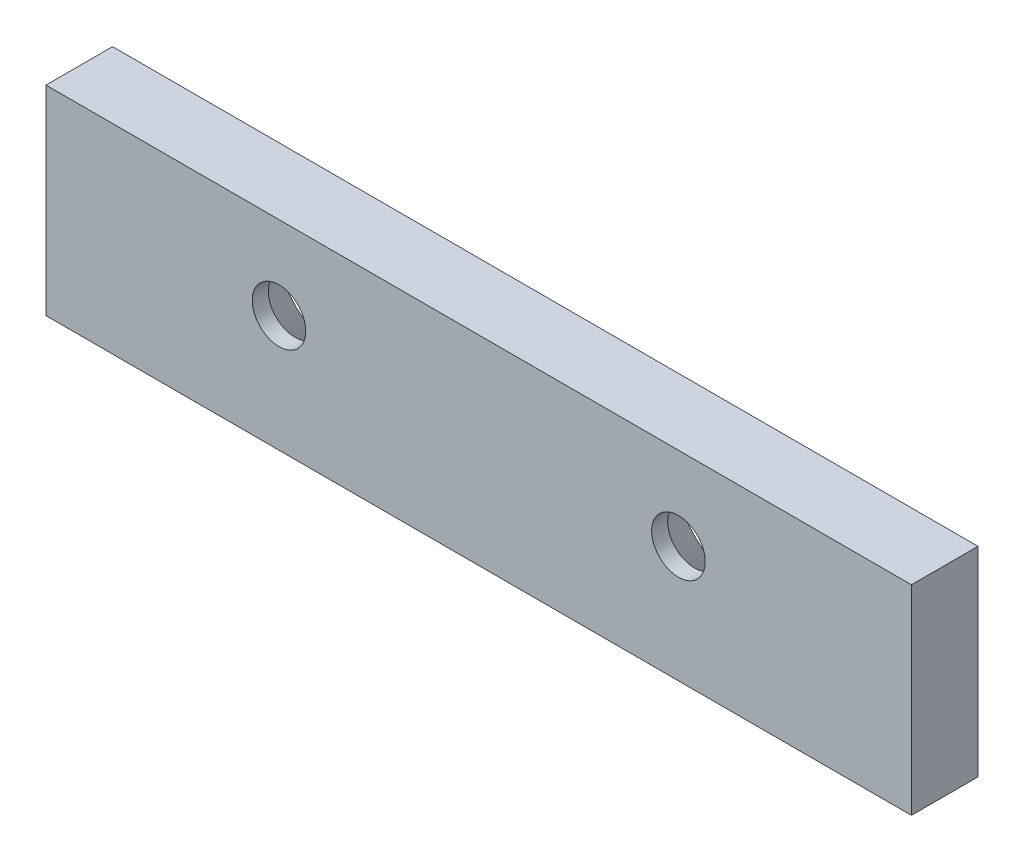
ISO-10303-21;
HEADER;
FILE_DESCRIPTION(('STEP AP214'),'2;1');
FILE_NAME('part.step','',(''),(''),'','','');
FILE_SCHEMA(('AUTOMOTIVE_DESIGN { 1 0 10303 214 1 1 1 1 }'));
ENDSEC;
DATA;
#1=APPLICATION_CONTEXT('core data for automotive mechanical design processes');
#2=APPLICATION_PROTOCOL_DEFINITION('international standard','automotive_design',2000,#1);
#3=PRODUCT_CONTEXT('',#1,'mechanical');
#4=PRODUCT('Part','Part','',(#3));
#5=PRODUCT_RELATED_PRODUCT_CATEGORY('part','',(#4));
#6=PRODUCT_DEFINITION_FORMATION('','',#4);
#7=PRODUCT_DEFINITION_CONTEXT('part definition',#1,'design');
#8=PRODUCT_DEFINITION('design','',#6,#7);
#9=PRODUCT_DEFINITION_SHAPE('','',#8);
#10=(LENGTH_UNIT() NAMED_UNIT(*) SI_UNIT(.MILLI.,.METRE.));
#11=(NAMED_UNIT(*) PLANE_ANGLE_UNIT() SI_UNIT($,.RADIAN.));
#12=(NAMED_UNIT(*) SI_UNIT($,.STERADIAN.) SOLID_ANGLE_UNIT());
#13=UNCERTAINTY_MEASURE_WITH_UNIT(LENGTH_MEASURE(1.E-05),#10,'distance_accuracy_value','');
#14=(GEOMETRIC_REPRESENTATION_CONTEXT(3) GLOBAL_UNCERTAINTY_ASSIGNED_CONTEXT((#13)) GLOBAL_UNIT_ASSIGNED_CONTEXT((#10,
#11,#12)) REPRESENTATION_CONTEXT('',''));
#15=CARTESIAN_POINT('',(0.,0.,0.));
#16=DIRECTION('',(0.,0.,1.));
#17=DIRECTION('',(1.,0.,0.));
#18=AXIS2_PLACEMENT_3D('',#15,#16,#17);
#19=CARTESIAN_POINT('',(0.,0.,-6.35));
#20=DIRECTION('',(-1.,0.,0.));
#21=DIRECTION('',(0.,0.,1.));
#22=AXIS2_PLACEMENT_3D('',#19,#20,#21);
#23=PLANE('',#22);
#24=DIRECTION('',(0.,-1.,0.));
#25=VECTOR('',#24,1.);
#26=CARTESIAN_POINT('',(0.,0.,0.));
#27=LINE('',#26,#25);
#28=CARTESIAN_POINT('',(0.,19.05,0.));
#29=VERTEX_POINT('',#28);
#30=CARTESIAN_POINT('',(0.,0.,0.));
#31=VERTEX_POINT('',#30);
#32=EDGE_CURVE('E101',#29,#31,#27,.T.);
#33=ORIENTED_EDGE('',*,*,#32,.F.);
#34=DIRECTION('',(0.,0.,1.));
#35=VECTOR('',#34,1.);
#36=CARTESIAN_POINT('',(0.,19.05,-6.35));
#37=LINE('',#36,#35);
#38=CARTESIAN_POINT('',(0.,19.05,-6.35));
#39=VERTEX_POINT('',#38);
#40=EDGE_CURVE('E11',#39,#29,#37,.T.);
#41=ORIENTED_EDGE('',*,*,#40,.F.);
#42=DIRECTION('',(0.,-1.,0.));
#43=VECTOR('',#42,1.);
#44=CARTESIAN_POINT('',(0.,0.,-6.35));
#45=LINE('',#44,#43);
#46=CARTESIAN_POINT('',(0.,0.,-6.35));
#47=VERTEX_POINT('',#46);
#48=EDGE_CURVE('E94',#39,#47,#45,.T.);
#49=ORIENTED_EDGE('',*,*,#48,.T.);
#50=DIRECTION('',(0.,0.,1.));
#51=VECTOR('',#50,1.);
#52=CARTESIAN_POINT('',(0.,0.,-6.35));
#53=LINE('',#52,#51);
#54=EDGE_CURVE('E39',#47,#31,#53,.T.);
#55=ORIENTED_EDGE('',*,*,#54,.T.);
#56=EDGE_LOOP('',(#33,#41,#49,#55));
#57=FACE_BOUND('',#56,.T.);
#58=ADVANCED_FACE('F36',(#57),#23,.T.);
#59=CARTESIAN_POINT('',(0.,19.05,-6.35));
#60=DIRECTION('',(0.,1.,0.));
#61=DIRECTION('',(0.,0.,1.));
#62=AXIS2_PLACEMENT_3D('',#59,#60,#61);
#63=PLANE('',#62);
#64=DIRECTION('',(-1.,0.,0.));
#65=VECTOR('',#64,1.);
#66=CARTESIAN_POINT('',(0.,19.05,0.));
#67=LINE('',#66,#65);
#68=CARTESIAN_POINT('',(82.55,19.05,0.));
#69=VERTEX_POINT('',#68);
#70=EDGE_CURVE('E96',#69,#29,#67,.T.);
#71=ORIENTED_EDGE('',*,*,#70,.F.);
#72=DIRECTION('',(0.,0.,1.));
#73=VECTOR('',#72,1.);
#74=CARTESIAN_POINT('',(82.55,19.05,-6.35));
#75=LINE('',#74,#73);
#76=CARTESIAN_POINT('',(82.55,19.05,-6.35));
#77=VERTEX_POINT('',#76);
#78=EDGE_CURVE('E45',#77,#69,#75,.T.);
#79=ORIENTED_EDGE('',*,*,#78,.F.);
#80=DIRECTION('',(-1.,0.,0.));
#81=VECTOR('',#80,1.);
#82=CARTESIAN_POINT('',(0.,19.05,-6.35));
#83=LINE('',#82,#81);
#84=EDGE_CURVE('E91',#77,#39,#83,.T.);
#85=ORIENTED_EDGE('',*,*,#84,.T.);
#86=ORIENTED_EDGE('',*,*,#40,.T.);
#87=EDGE_LOOP('',(#71,#79,#85,#86));
#88=FACE_BOUND('',#87,.T.);
#89=ADVANCED_FACE('F112',(#88),#63,.T.);
#90=CARTESIAN_POINT('',(82.55,0.,-6.35));
#91=DIRECTION('',(1.,0.,0.));
#92=DIRECTION('',(0.,0.,-1.));
#93=AXIS2_PLACEMENT_3D('',#90,#91,#92);
#94=PLANE('',#93);
#95=DIRECTION('',(0.,1.,0.));
#96=VECTOR('',#95,1.);
#97=CARTESIAN_POINT('',(82.55,0.,0.));
#98=LINE('',#97,#96);
#99=CARTESIAN_POINT('',(82.55,0.,0.));
#100=VERTEX_POINT('',#99);
#101=EDGE_CURVE('E86',#100,#69,#98,.T.);
#102=ORIENTED_EDGE('',*,*,#101,.F.);
#103=DIRECTION('',(0.,0.,1.));
#104=VECTOR('',#103,1.);
#105=CARTESIAN_POINT('',(82.55,0.,-6.35));
#106=LINE('',#105,#104);
#107=CARTESIAN_POINT('',(82.55,0.,-6.35));
#108=VERTEX_POINT('',#107);
#109=EDGE_CURVE('E81',#108,#100,#106,.T.);
#110=ORIENTED_EDGE('',*,*,#109,.F.);
#111=DIRECTION('',(0.,1.,0.));
#112=VECTOR('',#111,1.);
#113=CARTESIAN_POINT('',(82.55,0.,-6.35));
#114=LINE('',#113,#112);
#115=EDGE_CURVE('E84',#108,#77,#114,.T.);
#116=ORIENTED_EDGE('',*,*,#115,.T.);
#117=ORIENTED_EDGE('',*,*,#78,.T.);
#118=EDGE_LOOP('',(#102,#110,#116,#117));
#119=FACE_BOUND('',#118,.T.);
#120=ADVANCED_FACE('F83',(#119),#94,.T.);
#121=CARTESIAN_POINT('',(0.,0.,-6.35));
#122=DIRECTION('',(0.,-1.,0.));
#123=DIRECTION('',(0.,0.,-1.));
#124=AXIS2_PLACEMENT_3D('',#121,#122,#123);
#125=PLANE('',#124);
#126=DIRECTION('',(1.,0.,0.));
#127=VECTOR('',#126,1.);
#128=CARTESIAN_POINT('',(0.,0.,0.));
#129=LINE('',#128,#127);
#130=EDGE_CURVE('E104',#31,#100,#129,.T.);
#131=ORIENTED_EDGE('',*,*,#130,.F.);
#132=ORIENTED_EDGE('',*,*,#54,.F.);
#133=DIRECTION('',(1.,0.,0.));
#134=VECTOR('',#133,1.);
#135=CARTESIAN_POINT('',(0.,0.,-6.35));
#136=LINE('',#135,#134);
#137=EDGE_CURVE('E90',#47,#108,#136,.T.);
#138=ORIENTED_EDGE('',*,*,#137,.T.);
#139=ORIENTED_EDGE('',*,*,#109,.T.);
#140=EDGE_LOOP('',(#131,#132,#138,#139));
#141=FACE_BOUND('',#140,.T.);
#142=ADVANCED_FACE('F93',(#141),#125,.T.);
#143=CARTESIAN_POINT('',(0.,0.,-6.35));
#144=DIRECTION('',(0.,0.,-1.));
#145=DIRECTION('',(-1.,0.,0.));
#146=AXIS2_PLACEMENT_3D('',#143,#144,#145);
#147=PLANE('',#146);
#148=CARTESIAN_POINT('',(22.225,11.1125,-6.35));
#149=DIRECTION('',(0.,0.,1.));
#150=DIRECTION('',(1.,0.,0.));
#151=AXIS2_PLACEMENT_3D('',#148,#149,#150);
#152=CIRCLE('',#151,6.7437);
#153=CARTESIAN_POINT('',(28.9687,11.1125,-6.35));
#154=VERTEX_POINT('',#153);
#155=EDGE_CURVE('E158',#154,#154,#152,.T.);
#156=ORIENTED_EDGE('',*,*,#155,.T.);
#157=EDGE_LOOP('',(#156));
#158=FACE_BOUND('',#157,.T.);
#159=CARTESIAN_POINT('',(60.325,11.1125,-6.35));
#160=DIRECTION('',(0.,0.,1.));
#161=DIRECTION('',(1.,0.,0.));
#162=AXIS2_PLACEMENT_3D('',#159,#160,#161);
#163=CIRCLE('',#162,6.7437);
#164=CARTESIAN_POINT('',(67.0687,11.1125,-6.35));
#165=VERTEX_POINT('',#164);
#166=EDGE_CURVE('E160',#165,#165,#163,.T.);
#167=ORIENTED_EDGE('',*,*,#166,.T.);
#168=EDGE_LOOP('',(#167));
#169=FACE_BOUND('',#168,.T.);
#170=ORIENTED_EDGE('',*,*,#48,.F.);
#171=ORIENTED_EDGE('',*,*,#84,.F.);
#172=ORIENTED_EDGE('',*,*,#115,.F.);
#173=ORIENTED_EDGE('',*,*,#137,.F.);
#174=EDGE_LOOP('',(#170,#171,#172,#173));
#175=FACE_BOUND('',#174,.T.);
#176=ADVANCED_FACE('F89',(#158,#169,#175),#147,.T.);
#177=CARTESIAN_POINT('',(0.,0.,0.));
#178=DIRECTION('',(0.,0.,-1.));
#179=DIRECTION('',(-1.,0.,0.));
#180=AXIS2_PLACEMENT_3D('',#177,#178,#179);
#181=PLANE('',#180);
#182=CARTESIAN_POINT('',(22.225,11.1125,0.));
#183=DIRECTION('',(0.,0.,1.));
#184=DIRECTION('',(1.,0.,0.));
#185=AXIS2_PLACEMENT_3D('',#182,#183,#184);
#186=CIRCLE('',#185,2.55269999999999);
#187=CARTESIAN_POINT('',(24.7777,11.1125,0.));
#188=VERTEX_POINT('',#187);
#189=EDGE_CURVE('E157',#188,#188,#186,.T.);
#190=ORIENTED_EDGE('',*,*,#189,.F.);
#191=EDGE_LOOP('',(#190));
#192=FACE_BOUND('',#191,.T.);
#193=CARTESIAN_POINT('',(60.325,11.1125,0.));
#194=DIRECTION('',(0.,0.,1.));
#195=DIRECTION('',(1.,0.,0.));
#196=AXIS2_PLACEMENT_3D('',#193,#194,#195);
#197=CIRCLE('',#196,2.55269999999999);
#198=CARTESIAN_POINT('',(62.8777,11.1125,0.));
#199=VERTEX_POINT('',#198);
#200=EDGE_CURVE('E166',#199,#199,#197,.T.);
#201=ORIENTED_EDGE('',*,*,#200,.F.);
#202=EDGE_LOOP('',(#201));
#203=FACE_BOUND('',#202,.T.);
#204=ORIENTED_EDGE('',*,*,#32,.T.);
#205=ORIENTED_EDGE('',*,*,#130,.T.);
#206=ORIENTED_EDGE('',*,*,#101,.T.);
#207=ORIENTED_EDGE('',*,*,#70,.T.);
#208=EDGE_LOOP('',(#204,#205,#206,#207));
#209=FACE_BOUND('',#208,.T.);
#210=ADVANCED_FACE('F111',(#192,#203,#209),#181,.F.);
#211=CARTESIAN_POINT('',(60.325,11.1125,-1.52880600533674));
#212=DIRECTION('',(0.,0.,-1.));
#213=DIRECTION('',(-1.,0.,0.));
#214=AXIS2_PLACEMENT_3D('',#211,#212,#213);
#215=CONICAL_SURFACE('',#214,2.55270000000001,0.715584993317674);
#216=ORIENTED_EDGE('',*,*,#166,.F.);
#217=EDGE_LOOP('',(#216));
#218=FACE_BOUND('',#217,.T.);
#219=CARTESIAN_POINT('',(60.325,11.1125,-1.52880600533674));
#220=DIRECTION('',(0.,0.,1.));
#221=DIRECTION('',(1.,0.,0.));
#222=AXIS2_PLACEMENT_3D('',#219,#220,#221);
#223=CIRCLE('',#222,2.55270000000001);
#224=CARTESIAN_POINT('',(62.8777,11.1125,-1.52880600533674));
#225=VERTEX_POINT('',#224);
#226=EDGE_CURVE('E105',#225,#225,#223,.T.);
#227=ORIENTED_EDGE('',*,*,#226,.T.);
#228=EDGE_LOOP('',(#227));
#229=FACE_BOUND('',#228,.T.);
#230=ADVANCED_FACE('F130',(#218,#229),#215,.F.);
#231=CARTESIAN_POINT('',(60.325,11.1125,0.));
#232=DIRECTION('',(0.,0.,1.));
#233=DIRECTION('',(1.,0.,0.));
#234=AXIS2_PLACEMENT_3D('',#231,#232,#233);
#235=CYLINDRICAL_SURFACE('',#234,2.5527);
#236=ORIENTED_EDGE('',*,*,#226,.F.);
#237=EDGE_LOOP('',(#236));
#238=FACE_BOUND('',#237,.T.);
#239=ORIENTED_EDGE('',*,*,#200,.T.);
#240=EDGE_LOOP('',(#239));
#241=FACE_BOUND('',#240,.T.);
#242=ADVANCED_FACE('F137',(#238,#241),#235,.F.);
#243=CARTESIAN_POINT('',(22.225,11.1125,-1.52880600533674));
#244=DIRECTION('',(0.,0.,-1.));
#245=DIRECTION('',(-1.,0.,0.));
#246=AXIS2_PLACEMENT_3D('',#243,#244,#245);
#247=CONICAL_SURFACE('',#246,2.5527,0.715584993317674);
#248=ORIENTED_EDGE('',*,*,#155,.F.);
#249=EDGE_LOOP('',(#248));
#250=FACE_BOUND('',#249,.T.);
#251=CARTESIAN_POINT('',(22.225,11.1125,-1.52880600533674));
#252=DIRECTION('',(0.,0.,1.));
#253=DIRECTION('',(1.,0.,0.));
#254=AXIS2_PLACEMENT_3D('',#251,#252,#253);
#255=CIRCLE('',#254,2.5527);
#256=CARTESIAN_POINT('',(24.7777,11.1125,-1.52880600533674));
#257=VERTEX_POINT('',#256);
#258=EDGE_CURVE('E154',#257,#257,#255,.T.);
#259=ORIENTED_EDGE('',*,*,#258,.T.);
#260=EDGE_LOOP('',(#259));
#261=FACE_BOUND('',#260,.T.);
#262=ADVANCED_FACE('F141',(#250,#261),#247,.F.);
#263=CARTESIAN_POINT('',(22.225,11.1125,0.));
#264=DIRECTION('',(0.,0.,1.));
#265=DIRECTION('',(1.,0.,0.));
#266=AXIS2_PLACEMENT_3D('',#263,#264,#265);
#267=CYLINDRICAL_SURFACE('',#266,2.55269999999999);
#268=ORIENTED_EDGE('',*,*,#258,.F.);
#269=EDGE_LOOP('',(#268));
#270=FACE_BOUND('',#269,.T.);
#271=ORIENTED_EDGE('',*,*,#189,.T.);
#272=EDGE_LOOP('',(#271));
#273=FACE_BOUND('',#272,.T.);
#274=ADVANCED_FACE('F145',(#270,#273),#267,.F.);
#275=CLOSED_SHELL('',(#58,#89,#120,#142,#176,#210,#230,#242,#262,#274));
#276=MANIFOLD_SOLID_BREP('B2',#275);
#277=ADVANCED_BREP_SHAPE_REPRESENTATION('',(#18,#276),#14);
#278=SHAPE_DEFINITION_REPRESENTATION(#9,#277);
ENDSEC;
END-ISO-10303-21;
